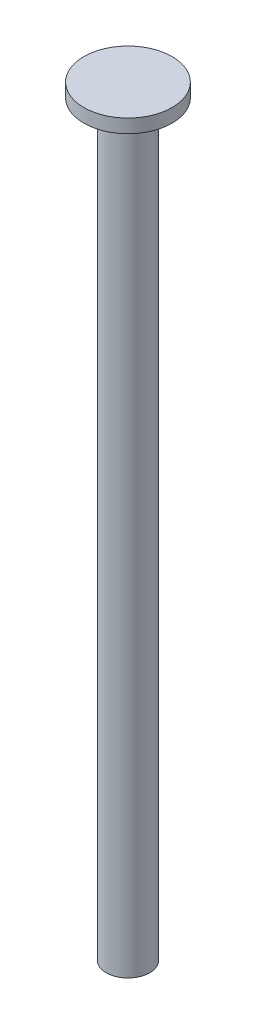
ISO-10303-21;
HEADER;
FILE_DESCRIPTION(('STEP AP214'),'2;1');
FILE_NAME('part.step','',(''),(''),'','','');
FILE_SCHEMA(('AUTOMOTIVE_DESIGN { 1 0 10303 214 1 1 1 1 }'));
ENDSEC;
DATA;
#1=APPLICATION_CONTEXT('core data for automotive mechanical design processes');
#2=APPLICATION_PROTOCOL_DEFINITION('international standard','automotive_design',2000,#1);
#3=PRODUCT_CONTEXT('',#1,'mechanical');
#4=PRODUCT('Part','Part','',(#3));
#5=PRODUCT_RELATED_PRODUCT_CATEGORY('part','',(#4));
#6=PRODUCT_DEFINITION_FORMATION('','',#4);
#7=PRODUCT_DEFINITION_CONTEXT('part definition',#1,'design');
#8=PRODUCT_DEFINITION('design','',#6,#7);
#9=PRODUCT_DEFINITION_SHAPE('','',#8);
#10=(LENGTH_UNIT() NAMED_UNIT(*) SI_UNIT(.MILLI.,.METRE.));
#11=(NAMED_UNIT(*) PLANE_ANGLE_UNIT() SI_UNIT($,.RADIAN.));
#12=(NAMED_UNIT(*) SI_UNIT($,.STERADIAN.) SOLID_ANGLE_UNIT());
#13=UNCERTAINTY_MEASURE_WITH_UNIT(LENGTH_MEASURE(1.E-05),#10,'distance_accuracy_value','');
#14=(GEOMETRIC_REPRESENTATION_CONTEXT(3) GLOBAL_UNCERTAINTY_ASSIGNED_CONTEXT((#13)) GLOBAL_UNIT_ASSIGNED_CONTEXT((#10,
#11,#12)) REPRESENTATION_CONTEXT('',''));
#15=CARTESIAN_POINT('',(0.,0.,0.));
#16=DIRECTION('',(0.,0.,1.));
#17=DIRECTION('',(1.,0.,0.));
#18=AXIS2_PLACEMENT_3D('',#15,#16,#17);
#19=CARTESIAN_POINT('',(0.,1.,0.));
#20=DIRECTION('',(0.,-1.,0.));
#21=DIRECTION('',(0.,0.,-1.));
#22=AXIS2_PLACEMENT_3D('',#19,#20,#21);
#23=CYLINDRICAL_SURFACE('',#22,3.25);
#24=CARTESIAN_POINT('',(0.,1.,0.));
#25=DIRECTION('',(0.,1.,0.));
#26=DIRECTION('',(0.,0.,1.));
#27=AXIS2_PLACEMENT_3D('',#24,#25,#26);
#28=CIRCLE('',#27,3.25);
#29=CARTESIAN_POINT('',(0.,1.,3.25));
#30=VERTEX_POINT('',#29);
#31=EDGE_CURVE('E10',#30,#30,#28,.T.);
#32=ORIENTED_EDGE('',*,*,#31,.F.);
#33=EDGE_LOOP('',(#32));
#34=FACE_BOUND('',#33,.T.);
#35=CARTESIAN_POINT('',(0.,0.,0.));
#36=DIRECTION('',(0.,1.,0.));
#37=DIRECTION('',(0.,0.,1.));
#38=AXIS2_PLACEMENT_3D('',#35,#36,#37);
#39=CIRCLE('',#38,3.25);
#40=CARTESIAN_POINT('',(0.,0.,3.25));
#41=VERTEX_POINT('',#40);
#42=EDGE_CURVE('E46',#41,#41,#39,.T.);
#43=ORIENTED_EDGE('',*,*,#42,.T.);
#44=EDGE_LOOP('',(#43));
#45=FACE_BOUND('',#44,.T.);
#46=ADVANCED_FACE('F43',(#34,#45),#23,.T.);
#47=CARTESIAN_POINT('',(0.,1.,0.));
#48=DIRECTION('',(0.,1.,0.));
#49=DIRECTION('',(0.,0.,1.));
#50=AXIS2_PLACEMENT_3D('',#47,#48,#49);
#51=PLANE('',#50);
#52=ORIENTED_EDGE('',*,*,#31,.T.);
#53=EDGE_LOOP('',(#52));
#54=FACE_BOUND('',#53,.T.);
#55=ADVANCED_FACE('F77',(#54),#51,.T.);
#56=CARTESIAN_POINT('',(0.,0.,0.));
#57=DIRECTION('',(0.,1.,0.));
#58=DIRECTION('',(0.,0.,1.));
#59=AXIS2_PLACEMENT_3D('',#56,#57,#58);
#60=PLANE('',#59);
#61=CARTESIAN_POINT('',(0.,0.,0.));
#62=DIRECTION('',(0.,1.,0.));
#63=DIRECTION('',(0.,0.,1.));
#64=AXIS2_PLACEMENT_3D('',#61,#62,#63);
#65=CIRCLE('',#64,1.6);
#66=CARTESIAN_POINT('',(0.,0.,1.6));
#67=VERTEX_POINT('',#66);
#68=EDGE_CURVE('E57',#67,#67,#65,.T.);
#69=ORIENTED_EDGE('',*,*,#68,.T.);
#70=EDGE_LOOP('',(#69));
#71=FACE_BOUND('',#70,.T.);
#72=ORIENTED_EDGE('',*,*,#42,.F.);
#73=EDGE_LOOP('',(#72));
#74=FACE_BOUND('',#73,.T.);
#75=ADVANCED_FACE('F74',(#71,#74),#60,.F.);
#76=CARTESIAN_POINT('',(0.,-55.,0.));
#77=DIRECTION('',(0.,1.,0.));
#78=DIRECTION('',(0.,0.,1.));
#79=AXIS2_PLACEMENT_3D('',#76,#77,#78);
#80=CYLINDRICAL_SURFACE('',#79,1.6);
#81=CARTESIAN_POINT('',(0.,-55.,0.));
#82=DIRECTION('',(0.,1.,0.));
#83=DIRECTION('',(0.,0.,1.));
#84=AXIS2_PLACEMENT_3D('',#81,#82,#83);
#85=CIRCLE('',#84,1.6);
#86=CARTESIAN_POINT('',(0.,-55.,1.6));
#87=VERTEX_POINT('',#86);
#88=EDGE_CURVE('E55',#87,#87,#85,.T.);
#89=ORIENTED_EDGE('',*,*,#88,.T.);
#90=EDGE_LOOP('',(#89));
#91=FACE_BOUND('',#90,.T.);
#92=ORIENTED_EDGE('',*,*,#68,.F.);
#93=EDGE_LOOP('',(#92));
#94=FACE_BOUND('',#93,.T.);
#95=ADVANCED_FACE('F65',(#91,#94),#80,.T.);
#96=CARTESIAN_POINT('',(0.,-55.,0.));
#97=DIRECTION('',(0.,1.,0.));
#98=DIRECTION('',(0.,0.,1.));
#99=AXIS2_PLACEMENT_3D('',#96,#97,#98);
#100=PLANE('',#99);
#101=ORIENTED_EDGE('',*,*,#88,.F.);
#102=EDGE_LOOP('',(#101));
#103=FACE_BOUND('',#102,.T.);
#104=ADVANCED_FACE('F68',(#103),#100,.F.);
#105=CLOSED_SHELL('',(#46,#55,#75,#95,#104));
#106=MANIFOLD_SOLID_BREP('B2',#105);
#107=ADVANCED_BREP_SHAPE_REPRESENTATION('',(#18,#106),#14);
#108=SHAPE_DEFINITION_REPRESENTATION(#9,#107);
ENDSEC;
END-ISO-10303-21;
